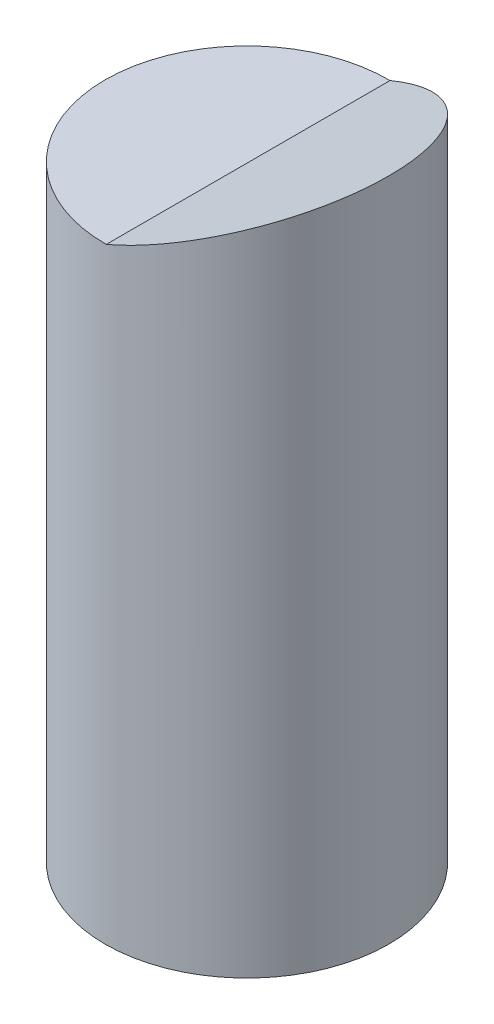
ISO-10303-21;
HEADER;
FILE_DESCRIPTION(('STEP AP214'),'2;1');
FILE_NAME('part.step','',(''),(''),'','','');
FILE_SCHEMA(('AUTOMOTIVE_DESIGN { 1 0 10303 214 1 1 1 1 }'));
ENDSEC;
DATA;
#1=APPLICATION_CONTEXT('core data for automotive mechanical design processes');
#2=APPLICATION_PROTOCOL_DEFINITION('international standard','automotive_design',2000,#1);
#3=PRODUCT_CONTEXT('',#1,'mechanical');
#4=PRODUCT('Part','Part','',(#3));
#5=PRODUCT_RELATED_PRODUCT_CATEGORY('part','',(#4));
#6=PRODUCT_DEFINITION_FORMATION('','',#4);
#7=PRODUCT_DEFINITION_CONTEXT('part definition',#1,'design');
#8=PRODUCT_DEFINITION('design','',#6,#7);
#9=PRODUCT_DEFINITION_SHAPE('','',#8);
#10=(LENGTH_UNIT() NAMED_UNIT(*) SI_UNIT(.MILLI.,.METRE.));
#11=(NAMED_UNIT(*) PLANE_ANGLE_UNIT() SI_UNIT($,.RADIAN.));
#12=(NAMED_UNIT(*) SI_UNIT($,.STERADIAN.) SOLID_ANGLE_UNIT());
#13=UNCERTAINTY_MEASURE_WITH_UNIT(LENGTH_MEASURE(1.E-05),#10,'distance_accuracy_value','');
#14=(GEOMETRIC_REPRESENTATION_CONTEXT(3) GLOBAL_UNCERTAINTY_ASSIGNED_CONTEXT((#13)) GLOBAL_UNIT_ASSIGNED_CONTEXT((#10,
#11,#12)) REPRESENTATION_CONTEXT('',''));
#15=CARTESIAN_POINT('',(0.,0.,0.));
#16=DIRECTION('',(0.,0.,1.));
#17=DIRECTION('',(1.,0.,0.));
#18=AXIS2_PLACEMENT_3D('',#15,#16,#17);
#19=CARTESIAN_POINT('',(7.24999999999995,33.9999999999999,-7.25000000000003));
#20=DIRECTION('',(-0.385107880416411,0.922871562267024,0.));
#21=DIRECTION('',(-0.922871562267025,-0.385107880416411,0.));
#22=AXIS2_PLACEMENT_3D('',#19,#20,#21);
#23=PLANE('',#22);
#24=DIRECTION('',(0.,0.,0.999999999999999));
#25=VECTOR('',#24,1.);
#26=CARTESIAN_POINT('',(0.060807496830656,31.,0.));
#27=LINE('',#26,#25);
#28=CARTESIAN_POINT('',(0.060807496830656,31.,-7.24974499195177));
#29=VERTEX_POINT('',#28);
#30=CARTESIAN_POINT('',(0.060807496830656,31.,7.24974499195172));
#31=VERTEX_POINT('',#30);
#32=EDGE_CURVE('E13',#29,#31,#27,.T.);
#33=ORIENTED_EDGE('',*,*,#32,.T.);
#34=CARTESIAN_POINT('',(0.,30.9746254547486,0.));
#35=DIRECTION('',(-0.385107880416411,0.922871562267024,0.));
#36=DIRECTION('',(0.922871562267025,0.385107880416411,0.));
#37=AXIS2_PLACEMENT_3D('',#34,#35,#36);
#38=ELLIPSE('',#37,7.85591440502343,7.25);
#39=EDGE_CURVE('E63',#31,#29,#38,.T.);
#40=ORIENTED_EDGE('',*,*,#39,.T.);
#41=EDGE_LOOP('',(#33,#40));
#42=FACE_BOUND('',#41,.T.);
#43=ADVANCED_FACE('F50',(#42),#23,.T.);
#44=CARTESIAN_POINT('',(0.,31.,0.));
#45=DIRECTION('',(0.,-1.,0.));
#46=DIRECTION('',(0.,0.,-0.999999999999999));
#47=AXIS2_PLACEMENT_3D('',#44,#45,#46);
#48=CYLINDRICAL_SURFACE('',#47,7.25);
#49=ORIENTED_EDGE('',*,*,#39,.F.);
#50=CARTESIAN_POINT('',(0.,31.,0.));
#51=DIRECTION('',(0.,1.,0.));
#52=DIRECTION('',(0.,0.,0.999999999999999));
#53=AXIS2_PLACEMENT_3D('',#50,#51,#52);
#54=CIRCLE('',#53,7.25);
#55=EDGE_CURVE('E58',#29,#31,#54,.T.);
#56=ORIENTED_EDGE('',*,*,#55,.F.);
#57=EDGE_LOOP('',(#49,#56));
#58=FACE_BOUND('',#57,.T.);
#59=CARTESIAN_POINT('',(0.,0.,0.));
#60=DIRECTION('',(0.,1.,0.));
#61=DIRECTION('',(0.,0.,0.999999999999999));
#62=AXIS2_PLACEMENT_3D('',#59,#60,#61);
#63=CIRCLE('',#62,7.25);
#64=CARTESIAN_POINT('',(0.,0.,7.25));
#65=VERTEX_POINT('',#64);
#66=EDGE_CURVE('E69',#65,#65,#63,.T.);
#67=ORIENTED_EDGE('',*,*,#66,.T.);
#68=EDGE_LOOP('',(#67));
#69=FACE_BOUND('',#68,.T.);
#70=ADVANCED_FACE('F52',(#58,#69),#48,.T.);
#71=CARTESIAN_POINT('',(0.,31.,0.));
#72=DIRECTION('',(0.,1.,0.));
#73=DIRECTION('',(0.,0.,0.999999999999999));
#74=AXIS2_PLACEMENT_3D('',#71,#72,#73);
#75=PLANE('',#74);
#76=ORIENTED_EDGE('',*,*,#32,.F.);
#77=ORIENTED_EDGE('',*,*,#55,.T.);
#78=EDGE_LOOP('',(#76,#77));
#79=FACE_BOUND('',#78,.T.);
#80=ADVANCED_FACE('F72',(#79),#75,.T.);
#81=CARTESIAN_POINT('',(0.,0.,0.));
#82=DIRECTION('',(0.,1.,0.));
#83=DIRECTION('',(0.,0.,0.999999999999999));
#84=AXIS2_PLACEMENT_3D('',#81,#82,#83);
#85=PLANE('',#84);
#86=ORIENTED_EDGE('',*,*,#66,.F.);
#87=EDGE_LOOP('',(#86));
#88=FACE_BOUND('',#87,.T.);
#89=ADVANCED_FACE('F81',(#88),#85,.F.);
#90=CLOSED_SHELL('',(#43,#70,#80,#89));
#91=MANIFOLD_SOLID_BREP('B2',#90);
#92=ADVANCED_BREP_SHAPE_REPRESENTATION('',(#18,#91),#14);
#93=SHAPE_DEFINITION_REPRESENTATION(#9,#92);
ENDSEC;
END-ISO-10303-21;
